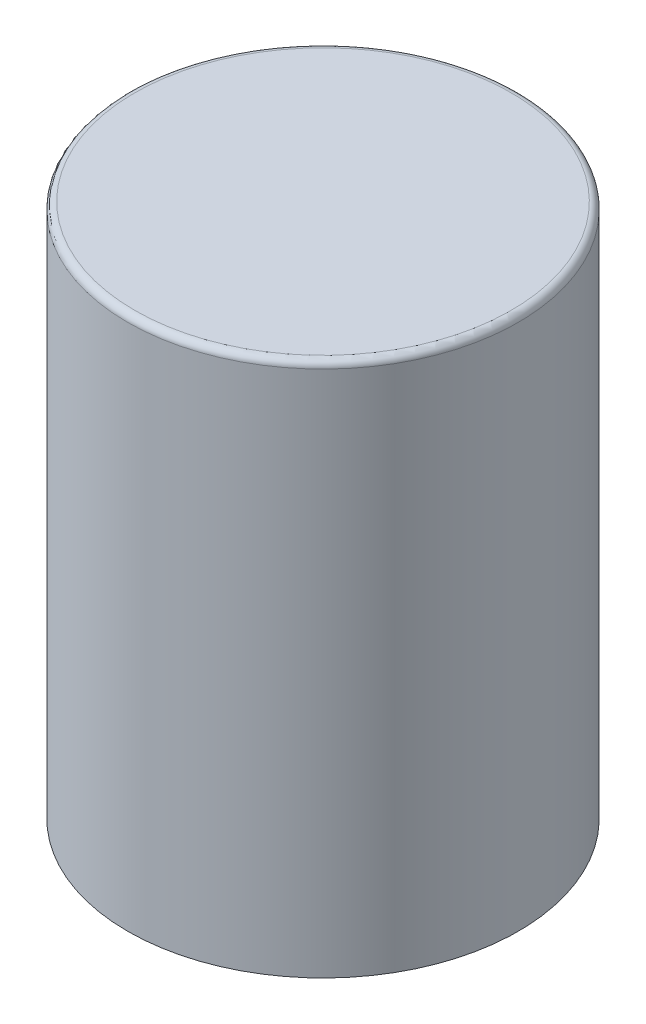
ISO-10303-21;
HEADER;
FILE_DESCRIPTION(('STEP AP214'),'2;1');
FILE_NAME('part.step','',(''),(''),'','','');
FILE_SCHEMA(('AUTOMOTIVE_DESIGN { 1 0 10303 214 1 1 1 1 }'));
ENDSEC;
DATA;
#1=APPLICATION_CONTEXT('core data for automotive mechanical design processes');
#2=APPLICATION_PROTOCOL_DEFINITION('international standard','automotive_design',2000,#1);
#3=PRODUCT_CONTEXT('',#1,'mechanical');
#4=PRODUCT('Part','Part','',(#3));
#5=PRODUCT_RELATED_PRODUCT_CATEGORY('part','',(#4));
#6=PRODUCT_DEFINITION_FORMATION('','',#4);
#7=PRODUCT_DEFINITION_CONTEXT('part definition',#1,'design');
#8=PRODUCT_DEFINITION('design','',#6,#7);
#9=PRODUCT_DEFINITION_SHAPE('','',#8);
#10=(LENGTH_UNIT() NAMED_UNIT(*) SI_UNIT(.MILLI.,.METRE.));
#11=(NAMED_UNIT(*) PLANE_ANGLE_UNIT() SI_UNIT($,.RADIAN.));
#12=(NAMED_UNIT(*) SI_UNIT($,.STERADIAN.) SOLID_ANGLE_UNIT());
#13=UNCERTAINTY_MEASURE_WITH_UNIT(LENGTH_MEASURE(1.E-05),#10,'distance_accuracy_value','');
#14=(GEOMETRIC_REPRESENTATION_CONTEXT(3) GLOBAL_UNCERTAINTY_ASSIGNED_CONTEXT((#13)) GLOBAL_UNIT_ASSIGNED_CONTEXT((#10,
#11,#12)) REPRESENTATION_CONTEXT('',''));
#15=CARTESIAN_POINT('',(0.,0.,0.));
#16=DIRECTION('',(0.,0.,1.));
#17=DIRECTION('',(1.,0.,0.));
#18=AXIS2_PLACEMENT_3D('',#15,#16,#17);
#19=CARTESIAN_POINT('',(571.090410182944,122.802924570118,0.));
#20=DIRECTION('',(0.,1.,0.));
#21=DIRECTION('',(0.,0.,1.));
#22=AXIS2_PLACEMENT_3D('',#19,#20,#21);
#23=CYLINDRICAL_SURFACE('',#22,28.);
#24=CARTESIAN_POINT('',(571.090410182944,121.802924570118,0.));
#25=DIRECTION('',(0.,1.,0.));
#26=DIRECTION('',(0.,0.,1.));
#27=AXIS2_PLACEMENT_3D('',#24,#25,#26);
#28=CIRCLE('',#27,28.);
#29=CARTESIAN_POINT('',(571.090410182944,121.802924570118,28.));
#30=VERTEX_POINT('',#29);
#31=EDGE_CURVE('E10',#30,#30,#28,.F.);
#32=ORIENTED_EDGE('',*,*,#31,.T.);
#33=EDGE_LOOP('',(#32));
#34=FACE_BOUND('',#33,.T.);
#35=CARTESIAN_POINT('',(571.090410182944,46.2046787262833,0.));
#36=DIRECTION('',(0.,-1.,0.));
#37=DIRECTION('',(0.,0.,-1.));
#38=AXIS2_PLACEMENT_3D('',#35,#36,#37);
#39=CIRCLE('',#38,28.);
#40=CARTESIAN_POINT('',(571.090410182944,46.2046787262833,-28.));
#41=VERTEX_POINT('',#40);
#42=EDGE_CURVE('E55',#41,#41,#39,.F.);
#43=ORIENTED_EDGE('',*,*,#42,.T.);
#44=EDGE_LOOP('',(#43));
#45=FACE_BOUND('',#44,.T.);
#46=ADVANCED_FACE('F42',(#34,#45),#23,.T.);
#47=CARTESIAN_POINT('',(543.090410182944,122.802924570118,0.));
#48=DIRECTION('',(0.,1.,0.));
#49=DIRECTION('',(0.,0.,1.));
#50=AXIS2_PLACEMENT_3D('',#47,#48,#49);
#51=PLANE('',#50);
#52=CARTESIAN_POINT('',(571.090410182944,122.802924570118,0.));
#53=DIRECTION('',(0.,1.,0.));
#54=DIRECTION('',(0.,0.,1.));
#55=AXIS2_PLACEMENT_3D('',#52,#53,#54);
#56=CIRCLE('',#55,27.);
#57=CARTESIAN_POINT('',(571.090410182944,122.802924570118,27.));
#58=VERTEX_POINT('',#57);
#59=EDGE_CURVE('E50',#58,#58,#56,.T.);
#60=ORIENTED_EDGE('',*,*,#59,.T.);
#61=EDGE_LOOP('',(#60));
#62=FACE_BOUND('',#61,.T.);
#63=ADVANCED_FACE('F66',(#62),#51,.T.);
#64=CARTESIAN_POINT('',(571.090410182944,46.2046787262833,0.));
#65=DIRECTION('',(0.,-1.,0.));
#66=DIRECTION('',(0.,0.,-1.));
#67=AXIS2_PLACEMENT_3D('',#64,#65,#66);
#68=PLANE('',#67);
#69=ORIENTED_EDGE('',*,*,#42,.F.);
#70=EDGE_LOOP('',(#69));
#71=FACE_BOUND('',#70,.T.);
#72=ADVANCED_FACE('F64',(#71),#68,.T.);
#73=CARTESIAN_POINT('',(571.090410182944,121.802924570118,0.));
#74=DIRECTION('',(0.,1.,0.));
#75=DIRECTION('',(0.,0.,1.));
#76=AXIS2_PLACEMENT_3D('',#73,#74,#75);
#77=TOROIDAL_SURFACE('',#76,27.,1.);
#78=ORIENTED_EDGE('',*,*,#31,.F.);
#79=EDGE_LOOP('',(#78));
#80=FACE_BOUND('',#79,.T.);
#81=ORIENTED_EDGE('',*,*,#59,.F.);
#82=EDGE_LOOP('',(#81));
#83=FACE_BOUND('',#82,.T.);
#84=ADVANCED_FACE('F44',(#80,#83),#77,.T.);
#85=CLOSED_SHELL('',(#46,#63,#72,#84));
#86=MANIFOLD_SOLID_BREP('B2',#85);
#87=ADVANCED_BREP_SHAPE_REPRESENTATION('',(#18,#86),#14);
#88=SHAPE_DEFINITION_REPRESENTATION(#9,#87);
ENDSEC;
END-ISO-10303-21;
